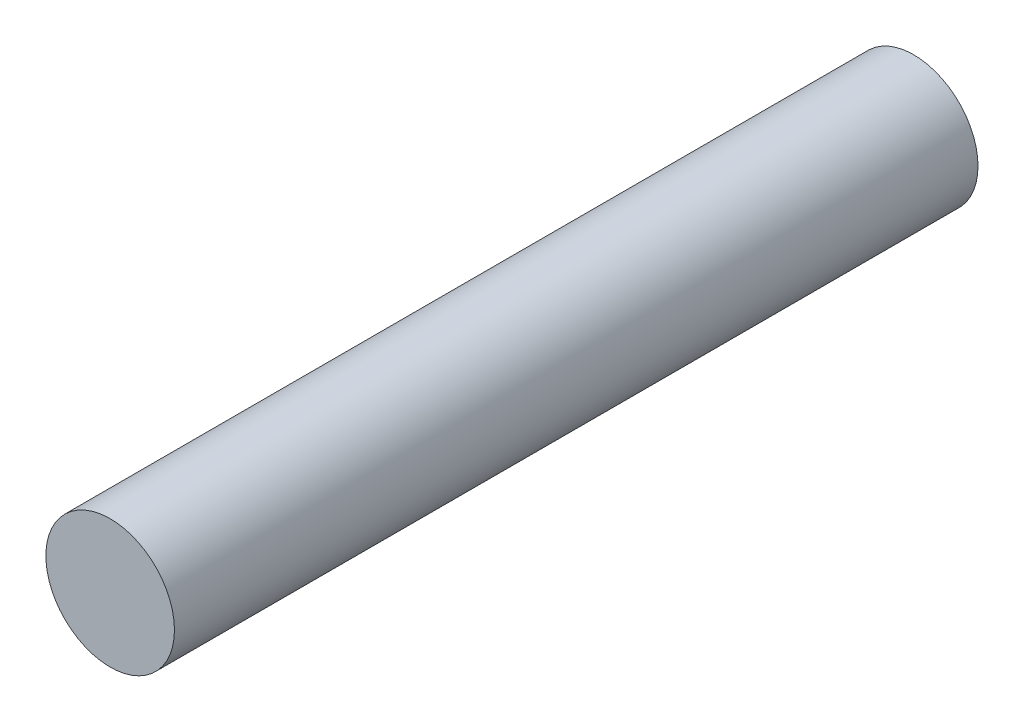
ISO-10303-21;
HEADER;
FILE_DESCRIPTION(('STEP AP214'),'2;1');
FILE_NAME('part.step','',(''),(''),'','','');
FILE_SCHEMA(('AUTOMOTIVE_DESIGN { 1 0 10303 214 1 1 1 1 }'));
ENDSEC;
DATA;
#1=APPLICATION_CONTEXT('core data for automotive mechanical design processes');
#2=APPLICATION_PROTOCOL_DEFINITION('international standard','automotive_design',2000,#1);
#3=PRODUCT_CONTEXT('',#1,'mechanical');
#4=PRODUCT('Part','Part','',(#3));
#5=PRODUCT_RELATED_PRODUCT_CATEGORY('part','',(#4));
#6=PRODUCT_DEFINITION_FORMATION('','',#4);
#7=PRODUCT_DEFINITION_CONTEXT('part definition',#1,'design');
#8=PRODUCT_DEFINITION('design','',#6,#7);
#9=PRODUCT_DEFINITION_SHAPE('','',#8);
#10=(LENGTH_UNIT() NAMED_UNIT(*) SI_UNIT(.MILLI.,.METRE.));
#11=(NAMED_UNIT(*) PLANE_ANGLE_UNIT() SI_UNIT($,.RADIAN.));
#12=(NAMED_UNIT(*) SI_UNIT($,.STERADIAN.) SOLID_ANGLE_UNIT());
#13=UNCERTAINTY_MEASURE_WITH_UNIT(LENGTH_MEASURE(1.E-05),#10,'distance_accuracy_value','');
#14=(GEOMETRIC_REPRESENTATION_CONTEXT(3) GLOBAL_UNCERTAINTY_ASSIGNED_CONTEXT((#13)) GLOBAL_UNIT_ASSIGNED_CONTEXT((#10,
#11,#12)) REPRESENTATION_CONTEXT('',''));
#15=CARTESIAN_POINT('',(0.,0.,0.));
#16=DIRECTION('',(0.,0.,1.));
#17=DIRECTION('',(1.,0.,0.));
#18=AXIS2_PLACEMENT_3D('',#15,#16,#17);
#19=CARTESIAN_POINT('',(0.,0.,175.));
#20=DIRECTION('',(0.,0.,-1.));
#21=DIRECTION('',(-1.,0.,0.));
#22=AXIS2_PLACEMENT_3D('',#19,#20,#21);
#23=CYLINDRICAL_SURFACE('',#22,14.);
#24=CARTESIAN_POINT('',(0.,0.,175.));
#25=DIRECTION('',(0.,0.,1.));
#26=DIRECTION('',(1.,0.,0.));
#27=AXIS2_PLACEMENT_3D('',#24,#25,#26);
#28=CIRCLE('',#27,14.);
#29=CARTESIAN_POINT('',(14.,0.,175.));
#30=VERTEX_POINT('',#29);
#31=EDGE_CURVE('E10',#30,#30,#28,.T.);
#32=ORIENTED_EDGE('',*,*,#31,.F.);
#33=EDGE_LOOP('',(#32));
#34=FACE_BOUND('',#33,.T.);
#35=CARTESIAN_POINT('',(0.,0.,0.));
#36=DIRECTION('',(0.,0.,1.));
#37=DIRECTION('',(1.,0.,0.));
#38=AXIS2_PLACEMENT_3D('',#35,#36,#37);
#39=CIRCLE('',#38,14.);
#40=CARTESIAN_POINT('',(14.,0.,0.));
#41=VERTEX_POINT('',#40);
#42=EDGE_CURVE('E46',#41,#41,#39,.T.);
#43=ORIENTED_EDGE('',*,*,#42,.T.);
#44=EDGE_LOOP('',(#43));
#45=FACE_BOUND('',#44,.T.);
#46=ADVANCED_FACE('F43',(#34,#45),#23,.T.);
#47=CARTESIAN_POINT('',(0.,0.,175.));
#48=DIRECTION('',(0.,0.,1.));
#49=DIRECTION('',(1.,0.,0.));
#50=AXIS2_PLACEMENT_3D('',#47,#48,#49);
#51=PLANE('',#50);
#52=ORIENTED_EDGE('',*,*,#31,.T.);
#53=EDGE_LOOP('',(#52));
#54=FACE_BOUND('',#53,.T.);
#55=ADVANCED_FACE('F60',(#54),#51,.T.);
#56=CARTESIAN_POINT('',(0.,0.,0.));
#57=DIRECTION('',(0.,0.,1.));
#58=DIRECTION('',(1.,0.,0.));
#59=AXIS2_PLACEMENT_3D('',#56,#57,#58);
#60=PLANE('',#59);
#61=ORIENTED_EDGE('',*,*,#42,.F.);
#62=EDGE_LOOP('',(#61));
#63=FACE_BOUND('',#62,.T.);
#64=ADVANCED_FACE('F58',(#63),#60,.F.);
#65=CLOSED_SHELL('',(#46,#55,#64));
#66=MANIFOLD_SOLID_BREP('B2',#65);
#67=ADVANCED_BREP_SHAPE_REPRESENTATION('',(#18,#66),#14);
#68=SHAPE_DEFINITION_REPRESENTATION(#9,#67);
ENDSEC;
END-ISO-10303-21;
